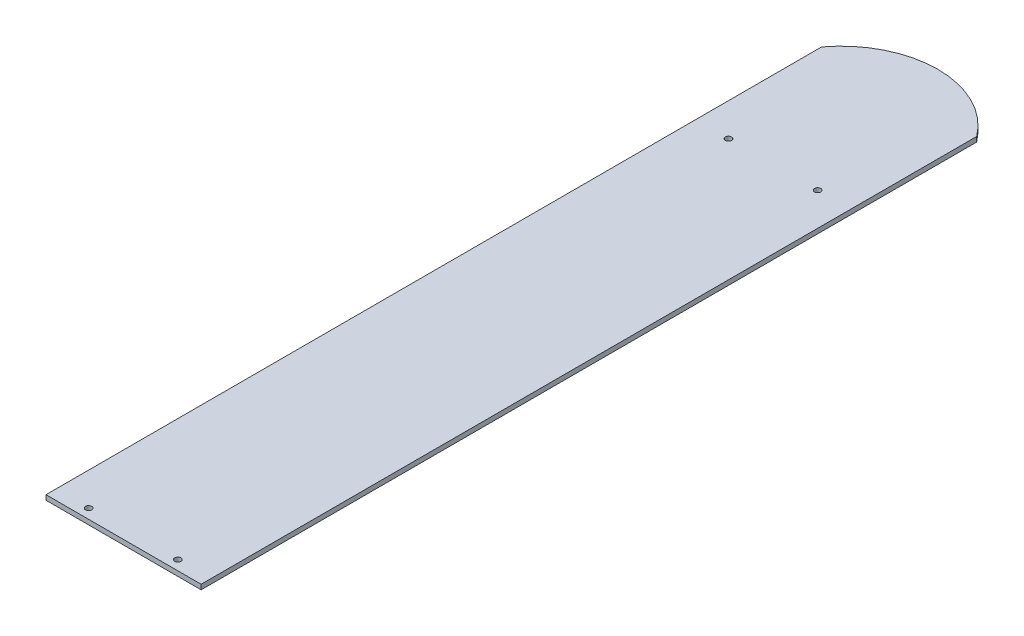
ISO-10303-21;
HEADER;
FILE_DESCRIPTION(('STEP AP214'),'2;1');
FILE_NAME('part.step','',(''),(''),'','','');
FILE_SCHEMA(('AUTOMOTIVE_DESIGN { 1 0 10303 214 1 1 1 1 }'));
ENDSEC;
DATA;
#1=APPLICATION_CONTEXT('core data for automotive mechanical design processes');
#2=APPLICATION_PROTOCOL_DEFINITION('international standard','automotive_design',2000,#1);
#3=PRODUCT_CONTEXT('',#1,'mechanical');
#4=PRODUCT('Part','Part','',(#3));
#5=PRODUCT_RELATED_PRODUCT_CATEGORY('part','',(#4));
#6=PRODUCT_DEFINITION_FORMATION('','',#4);
#7=PRODUCT_DEFINITION_CONTEXT('part definition',#1,'design');
#8=PRODUCT_DEFINITION('design','',#6,#7);
#9=PRODUCT_DEFINITION_SHAPE('','',#8);
#10=(LENGTH_UNIT() NAMED_UNIT(*) SI_UNIT(.MILLI.,.METRE.));
#11=(NAMED_UNIT(*) PLANE_ANGLE_UNIT() SI_UNIT($,.RADIAN.));
#12=(NAMED_UNIT(*) SI_UNIT($,.STERADIAN.) SOLID_ANGLE_UNIT());
#13=UNCERTAINTY_MEASURE_WITH_UNIT(LENGTH_MEASURE(1.E-05),#10,'distance_accuracy_value','');
#14=(GEOMETRIC_REPRESENTATION_CONTEXT(3) GLOBAL_UNCERTAINTY_ASSIGNED_CONTEXT((#13)) GLOBAL_UNIT_ASSIGNED_CONTEXT((#10,
#11,#12)) REPRESENTATION_CONTEXT('',''));
#15=CARTESIAN_POINT('',(0.,0.,0.));
#16=DIRECTION('',(0.,0.,1.));
#17=DIRECTION('',(1.,0.,0.));
#18=AXIS2_PLACEMENT_3D('',#15,#16,#17);
#19=CARTESIAN_POINT('',(50.8,1.984375,193.296187447726));
#20=DIRECTION('',(0.,-1.,0.));
#21=DIRECTION('',(0.,0.,-1.));
#22=AXIS2_PLACEMENT_3D('',#19,#20,#21);
#23=CYLINDRICAL_SURFACE('',#22,15.875);
#24=CARTESIAN_POINT('',(50.8,1.190625,193.296187447726));
#25=DIRECTION('',(0.,1.,0.));
#26=DIRECTION('',(0.,0.,-1.));
#27=AXIS2_PLACEMENT_3D('',#24,#25,#26);
#28=CIRCLE('',#27,15.875);
#29=CARTESIAN_POINT('',(63.5,1.190625,183.771187447726));
#30=VERTEX_POINT('',#29);
#31=CARTESIAN_POINT('',(38.1,1.190625,183.771187447726));
#32=VERTEX_POINT('',#31);
#33=EDGE_CURVE('E104',#30,#32,#28,.T.);
#34=ORIENTED_EDGE('',*,*,#33,.T.);
#35=DIRECTION('',(0.,-1.,0.));
#36=VECTOR('',#35,1.);
#37=CARTESIAN_POINT('',(38.1,1.984375,183.771187447726));
#38=LINE('',#37,#36);
#39=CARTESIAN_POINT('',(38.1,1.984375,183.771187447726));
#40=VERTEX_POINT('',#39);
#41=EDGE_CURVE('E11',#40,#32,#38,.T.);
#42=ORIENTED_EDGE('',*,*,#41,.F.);
#43=CARTESIAN_POINT('',(50.8,1.984375,193.296187447726));
#44=DIRECTION('',(0.,1.,0.));
#45=DIRECTION('',(0.,0.,-1.));
#46=AXIS2_PLACEMENT_3D('',#43,#44,#45);
#47=CIRCLE('',#46,15.875);
#48=CARTESIAN_POINT('',(63.5,1.984375,183.771187447726));
#49=VERTEX_POINT('',#48);
#50=EDGE_CURVE('E92',#49,#40,#47,.T.);
#51=ORIENTED_EDGE('',*,*,#50,.F.);
#52=DIRECTION('',(0.,-1.,0.));
#53=VECTOR('',#52,1.);
#54=CARTESIAN_POINT('',(63.5,1.984375,183.771187447726));
#55=LINE('',#54,#53);
#56=EDGE_CURVE('E100',#49,#30,#55,.T.);
#57=ORIENTED_EDGE('',*,*,#56,.T.);
#58=EDGE_LOOP('',(#34,#42,#51,#57));
#59=FACE_BOUND('',#58,.T.);
#60=ADVANCED_FACE('F41',(#59),#23,.T.);
#61=CARTESIAN_POINT('',(38.1,1.984375,183.771187447726));
#62=DIRECTION('',(1.,0.,0.));
#63=DIRECTION('',(0.,0.,-1.));
#64=AXIS2_PLACEMENT_3D('',#61,#62,#63);
#65=PLANE('',#64);
#66=DIRECTION('',(0.,0.,1.));
#67=VECTOR('',#66,1.);
#68=CARTESIAN_POINT('',(38.1,1.190625,183.771187447726));
#69=LINE('',#68,#67);
#70=CARTESIAN_POINT('',(38.1,1.190625,310.771187447726));
#71=VERTEX_POINT('',#70);
#72=EDGE_CURVE('E96',#32,#71,#69,.T.);
#73=ORIENTED_EDGE('',*,*,#72,.T.);
#74=DIRECTION('',(0.,-1.,0.));
#75=VECTOR('',#74,1.);
#76=CARTESIAN_POINT('',(38.1,1.984375,310.771187447726));
#77=LINE('',#76,#75);
#78=CARTESIAN_POINT('',(38.1,1.984375,310.771187447726));
#79=VERTEX_POINT('',#78);
#80=EDGE_CURVE('E49',#79,#71,#77,.T.);
#81=ORIENTED_EDGE('',*,*,#80,.F.);
#82=DIRECTION('',(0.,0.,1.));
#83=VECTOR('',#82,1.);
#84=CARTESIAN_POINT('',(38.1,1.984375,183.771187447726));
#85=LINE('',#84,#83);
#86=EDGE_CURVE('E87',#40,#79,#85,.T.);
#87=ORIENTED_EDGE('',*,*,#86,.F.);
#88=ORIENTED_EDGE('',*,*,#41,.T.);
#89=EDGE_LOOP('',(#73,#81,#87,#88));
#90=FACE_BOUND('',#89,.T.);
#91=ADVANCED_FACE('F95',(#90),#65,.F.);
#92=CARTESIAN_POINT('',(38.1,1.984375,310.771187447726));
#93=DIRECTION('',(0.,0.,-1.));
#94=DIRECTION('',(-1.,0.,0.));
#95=AXIS2_PLACEMENT_3D('',#92,#93,#94);
#96=PLANE('',#95);
#97=DIRECTION('',(1.,0.,0.));
#98=VECTOR('',#97,1.);
#99=CARTESIAN_POINT('',(38.1,1.190625,310.771187447726));
#100=LINE('',#99,#98);
#101=CARTESIAN_POINT('',(63.5,1.190625,310.771187447726));
#102=VERTEX_POINT('',#101);
#103=EDGE_CURVE('E74',#71,#102,#100,.T.);
#104=ORIENTED_EDGE('',*,*,#103,.T.);
#105=DIRECTION('',(0.,-1.,0.));
#106=VECTOR('',#105,1.);
#107=CARTESIAN_POINT('',(63.5,1.984375,310.771187447726));
#108=LINE('',#107,#106);
#109=CARTESIAN_POINT('',(63.5,1.984375,310.771187447726));
#110=VERTEX_POINT('',#109);
#111=EDGE_CURVE('E97',#110,#102,#108,.T.);
#112=ORIENTED_EDGE('',*,*,#111,.F.);
#113=DIRECTION('',(1.,0.,0.));
#114=VECTOR('',#113,1.);
#115=CARTESIAN_POINT('',(38.1,1.984375,310.771187447726));
#116=LINE('',#115,#114);
#117=EDGE_CURVE('E90',#79,#110,#116,.T.);
#118=ORIENTED_EDGE('',*,*,#117,.F.);
#119=ORIENTED_EDGE('',*,*,#80,.T.);
#120=EDGE_LOOP('',(#104,#112,#118,#119));
#121=FACE_BOUND('',#120,.T.);
#122=ADVANCED_FACE('F98',(#121),#96,.F.);
#123=CARTESIAN_POINT('',(63.5,1.984375,183.771187447726));
#124=DIRECTION('',(-1.,0.,0.));
#125=DIRECTION('',(0.,0.,1.));
#126=AXIS2_PLACEMENT_3D('',#123,#124,#125);
#127=PLANE('',#126);
#128=DIRECTION('',(0.,0.,-1.));
#129=VECTOR('',#128,1.);
#130=CARTESIAN_POINT('',(63.5,1.190625,183.771187447726));
#131=LINE('',#130,#129);
#132=EDGE_CURVE('E80',#102,#30,#131,.T.);
#133=ORIENTED_EDGE('',*,*,#132,.T.);
#134=ORIENTED_EDGE('',*,*,#56,.F.);
#135=DIRECTION('',(0.,0.,-1.));
#136=VECTOR('',#135,1.);
#137=CARTESIAN_POINT('',(63.5,1.984375,183.771187447726));
#138=LINE('',#137,#136);
#139=EDGE_CURVE('E57',#110,#49,#138,.T.);
#140=ORIENTED_EDGE('',*,*,#139,.F.);
#141=ORIENTED_EDGE('',*,*,#111,.T.);
#142=EDGE_LOOP('',(#133,#134,#140,#141));
#143=FACE_BOUND('',#142,.T.);
#144=ADVANCED_FACE('F112',(#143),#127,.F.);
#145=CARTESIAN_POINT('',(50.8,1.984375,193.296187447726));
#146=DIRECTION('',(0.,-1.,0.));
#147=DIRECTION('',(0.,0.,-1.));
#148=AXIS2_PLACEMENT_3D('',#145,#146,#147);
#149=PLANE('',#148);
#150=CARTESIAN_POINT('',(58.1025,1.984375,309.183687447726));
#151=DIRECTION('',(0.,-1.,0.));
#152=DIRECTION('',(0.,0.,-1.));
#153=AXIS2_PLACEMENT_3D('',#150,#151,#152);
#154=CIRCLE('',#153,0.507999999999992);
#155=CARTESIAN_POINT('',(58.1025,1.984375,308.675687447726));
#156=VERTEX_POINT('',#155);
#157=EDGE_CURVE('E121',#156,#156,#154,.T.);
#158=ORIENTED_EDGE('',*,*,#157,.T.);
#159=EDGE_LOOP('',(#158));
#160=FACE_BOUND('',#159,.T.);
#161=CARTESIAN_POINT('',(43.4975,1.984375,204.408687447726));
#162=DIRECTION('',(0.,-1.,0.));
#163=DIRECTION('',(0.,0.,-1.));
#164=AXIS2_PLACEMENT_3D('',#161,#162,#163);
#165=CIRCLE('',#164,0.508000000000002);
#166=CARTESIAN_POINT('',(43.4975,1.984375,203.900687447726));
#167=VERTEX_POINT('',#166);
#168=EDGE_CURVE('E127',#167,#167,#165,.T.);
#169=ORIENTED_EDGE('',*,*,#168,.T.);
#170=EDGE_LOOP('',(#169));
#171=FACE_BOUND('',#170,.T.);
#172=CARTESIAN_POINT('',(58.1025,1.984375,204.408687447726));
#173=DIRECTION('',(0.,-1.,0.));
#174=DIRECTION('',(0.,0.,-1.));
#175=AXIS2_PLACEMENT_3D('',#172,#173,#174);
#176=CIRCLE('',#175,0.508000000000002);
#177=CARTESIAN_POINT('',(58.1025,1.984375,203.900687447726));
#178=VERTEX_POINT('',#177);
#179=EDGE_CURVE('E128',#178,#178,#176,.T.);
#180=ORIENTED_EDGE('',*,*,#179,.T.);
#181=EDGE_LOOP('',(#180));
#182=FACE_BOUND('',#181,.T.);
#183=CARTESIAN_POINT('',(43.4975,1.984375,309.183687447726));
#184=DIRECTION('',(0.,-1.,0.));
#185=DIRECTION('',(0.,0.,-1.));
#186=AXIS2_PLACEMENT_3D('',#183,#184,#185);
#187=CIRCLE('',#186,0.507999999999996);
#188=CARTESIAN_POINT('',(43.4975,1.984375,308.675687447726));
#189=VERTEX_POINT('',#188);
#190=EDGE_CURVE('E107',#189,#189,#187,.T.);
#191=ORIENTED_EDGE('',*,*,#190,.T.);
#192=EDGE_LOOP('',(#191));
#193=FACE_BOUND('',#192,.T.);
#194=ORIENTED_EDGE('',*,*,#50,.T.);
#195=ORIENTED_EDGE('',*,*,#86,.T.);
#196=ORIENTED_EDGE('',*,*,#117,.T.);
#197=ORIENTED_EDGE('',*,*,#139,.T.);
#198=EDGE_LOOP('',(#194,#195,#196,#197));
#199=FACE_BOUND('',#198,.T.);
#200=ADVANCED_FACE('F88',(#160,#171,#182,#193,#199),#149,.F.);
#201=CARTESIAN_POINT('',(50.8,1.190625,193.296187447726));
#202=DIRECTION('',(0.,-1.,0.));
#203=DIRECTION('',(0.,0.,-1.));
#204=AXIS2_PLACEMENT_3D('',#201,#202,#203);
#205=PLANE('',#204);
#206=CARTESIAN_POINT('',(58.1025,1.190625,309.183687447726));
#207=DIRECTION('',(0.,-1.,0.));
#208=DIRECTION('',(0.,0.,-1.));
#209=AXIS2_PLACEMENT_3D('',#206,#207,#208);
#210=CIRCLE('',#209,0.507999999999992);
#211=CARTESIAN_POINT('',(58.1025,1.190625,308.675687447726));
#212=VERTEX_POINT('',#211);
#213=EDGE_CURVE('E131',#212,#212,#210,.T.);
#214=ORIENTED_EDGE('',*,*,#213,.F.);
#215=EDGE_LOOP('',(#214));
#216=FACE_BOUND('',#215,.T.);
#217=CARTESIAN_POINT('',(43.4975,1.190625,204.408687447726));
#218=DIRECTION('',(0.,-1.,0.));
#219=DIRECTION('',(0.,0.,-1.));
#220=AXIS2_PLACEMENT_3D('',#217,#218,#219);
#221=CIRCLE('',#220,0.508000000000002);
#222=CARTESIAN_POINT('',(43.4975,1.190625,203.900687447726));
#223=VERTEX_POINT('',#222);
#224=EDGE_CURVE('E124',#223,#223,#221,.T.);
#225=ORIENTED_EDGE('',*,*,#224,.F.);
#226=EDGE_LOOP('',(#225));
#227=FACE_BOUND('',#226,.T.);
#228=CARTESIAN_POINT('',(58.1025,1.190625,204.408687447726));
#229=DIRECTION('',(0.,-1.,0.));
#230=DIRECTION('',(0.,0.,-1.));
#231=AXIS2_PLACEMENT_3D('',#228,#229,#230);
#232=CIRCLE('',#231,0.508000000000002);
#233=CARTESIAN_POINT('',(58.1025,1.190625,203.900687447726));
#234=VERTEX_POINT('',#233);
#235=EDGE_CURVE('E136',#234,#234,#232,.T.);
#236=ORIENTED_EDGE('',*,*,#235,.F.);
#237=EDGE_LOOP('',(#236));
#238=FACE_BOUND('',#237,.T.);
#239=CARTESIAN_POINT('',(43.4975,1.190625,309.183687447726));
#240=DIRECTION('',(0.,-1.,0.));
#241=DIRECTION('',(0.,0.,-1.));
#242=AXIS2_PLACEMENT_3D('',#239,#240,#241);
#243=CIRCLE('',#242,0.507999999999996);
#244=CARTESIAN_POINT('',(43.4975,1.190625,308.675687447726));
#245=VERTEX_POINT('',#244);
#246=EDGE_CURVE('E118',#245,#245,#243,.T.);
#247=ORIENTED_EDGE('',*,*,#246,.F.);
#248=EDGE_LOOP('',(#247));
#249=FACE_BOUND('',#248,.T.);
#250=ORIENTED_EDGE('',*,*,#33,.F.);
#251=ORIENTED_EDGE('',*,*,#132,.F.);
#252=ORIENTED_EDGE('',*,*,#103,.F.);
#253=ORIENTED_EDGE('',*,*,#72,.F.);
#254=EDGE_LOOP('',(#250,#251,#252,#253));
#255=FACE_BOUND('',#254,.T.);
#256=ADVANCED_FACE('F115',(#216,#227,#238,#249,#255),#205,.T.);
#257=CARTESIAN_POINT('',(43.4975,1.984375,309.183687447726));
#258=DIRECTION('',(0.,-1.,0.));
#259=DIRECTION('',(0.,0.,-1.));
#260=AXIS2_PLACEMENT_3D('',#257,#258,#259);
#261=CYLINDRICAL_SURFACE('',#260,0.507999999999996);
#262=ORIENTED_EDGE('',*,*,#190,.F.);
#263=EDGE_LOOP('',(#262));
#264=FACE_BOUND('',#263,.T.);
#265=ORIENTED_EDGE('',*,*,#246,.T.);
#266=EDGE_LOOP('',(#265));
#267=FACE_BOUND('',#266,.T.);
#268=ADVANCED_FACE('F148',(#264,#267),#261,.F.);
#269=CARTESIAN_POINT('',(58.1025,1.984375,204.408687447726));
#270=DIRECTION('',(0.,-1.,0.));
#271=DIRECTION('',(0.,0.,-1.));
#272=AXIS2_PLACEMENT_3D('',#269,#270,#271);
#273=CYLINDRICAL_SURFACE('',#272,0.508000000000002);
#274=ORIENTED_EDGE('',*,*,#179,.F.);
#275=EDGE_LOOP('',(#274));
#276=FACE_BOUND('',#275,.T.);
#277=ORIENTED_EDGE('',*,*,#235,.T.);
#278=EDGE_LOOP('',(#277));
#279=FACE_BOUND('',#278,.T.);
#280=ADVANCED_FACE('F144',(#276,#279),#273,.F.);
#281=CARTESIAN_POINT('',(43.4975,1.984375,204.408687447726));
#282=DIRECTION('',(0.,-1.,0.));
#283=DIRECTION('',(0.,0.,-1.));
#284=AXIS2_PLACEMENT_3D('',#281,#282,#283);
#285=CYLINDRICAL_SURFACE('',#284,0.508000000000002);
#286=ORIENTED_EDGE('',*,*,#168,.F.);
#287=EDGE_LOOP('',(#286));
#288=FACE_BOUND('',#287,.T.);
#289=ORIENTED_EDGE('',*,*,#224,.T.);
#290=EDGE_LOOP('',(#289));
#291=FACE_BOUND('',#290,.T.);
#292=ADVANCED_FACE('F147',(#288,#291),#285,.F.);
#293=CARTESIAN_POINT('',(58.1025,1.984375,309.183687447726));
#294=DIRECTION('',(0.,-1.,0.));
#295=DIRECTION('',(0.,0.,-1.));
#296=AXIS2_PLACEMENT_3D('',#293,#294,#295);
#297=CYLINDRICAL_SURFACE('',#296,0.507999999999992);
#298=ORIENTED_EDGE('',*,*,#157,.F.);
#299=EDGE_LOOP('',(#298));
#300=FACE_BOUND('',#299,.T.);
#301=ORIENTED_EDGE('',*,*,#213,.T.);
#302=EDGE_LOOP('',(#301));
#303=FACE_BOUND('',#302,.T.);
#304=ADVANCED_FACE('F186',(#300,#303),#297,.F.);
#305=CLOSED_SHELL('',(#60,#91,#122,#144,#200,#256,#268,#280,#292,#304));
#306=MANIFOLD_SOLID_BREP('B2',#305);
#307=ADVANCED_BREP_SHAPE_REPRESENTATION('',(#18,#306),#14);
#308=SHAPE_DEFINITION_REPRESENTATION(#9,#307);
ENDSEC;
END-ISO-10303-21;
